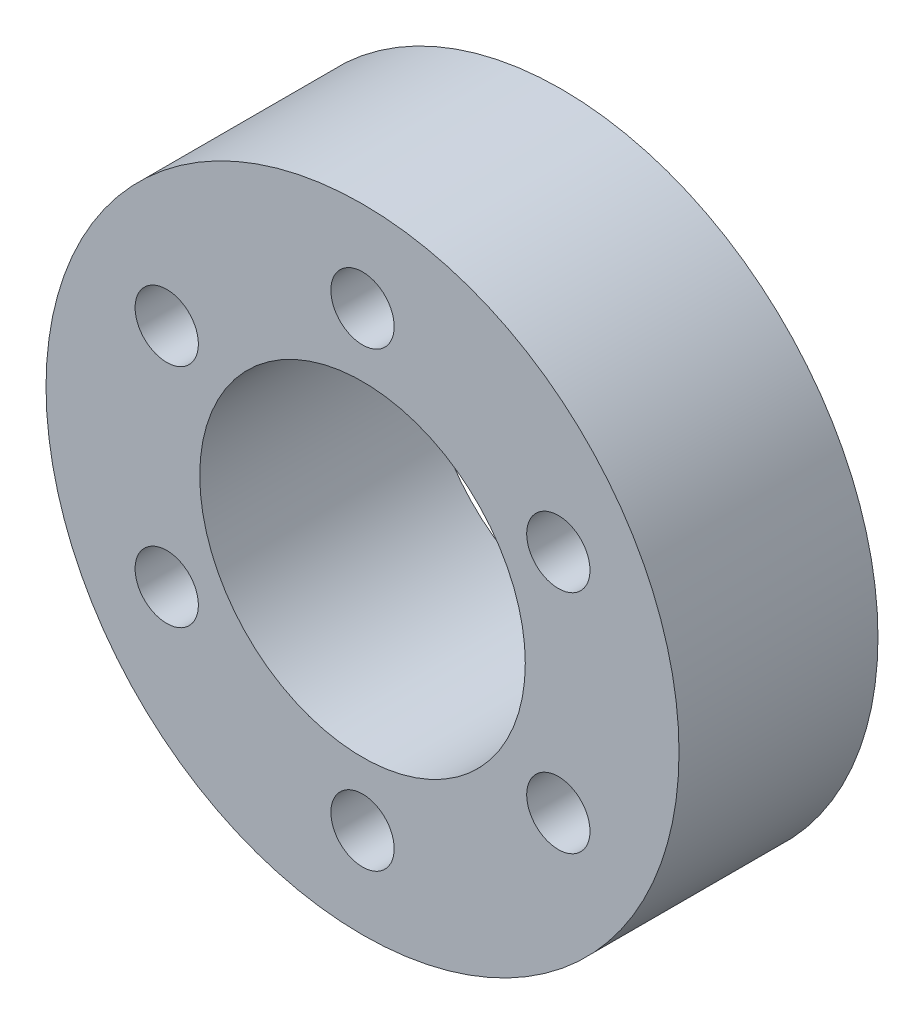
ISO-10303-21;
HEADER;
FILE_DESCRIPTION(('STEP AP214'),'2;1');
FILE_NAME('part.step','',(''),(''),'','','');
FILE_SCHEMA(('AUTOMOTIVE_DESIGN { 1 0 10303 214 1 1 1 1 }'));
ENDSEC;
DATA;
#1=APPLICATION_CONTEXT('core data for automotive mechanical design processes');
#2=APPLICATION_PROTOCOL_DEFINITION('international standard','automotive_design',2000,#1);
#3=PRODUCT_CONTEXT('',#1,'mechanical');
#4=PRODUCT('Part','Part','',(#3));
#5=PRODUCT_RELATED_PRODUCT_CATEGORY('part','',(#4));
#6=PRODUCT_DEFINITION_FORMATION('','',#4);
#7=PRODUCT_DEFINITION_CONTEXT('part definition',#1,'design');
#8=PRODUCT_DEFINITION('design','',#6,#7);
#9=PRODUCT_DEFINITION_SHAPE('','',#8);
#10=(LENGTH_UNIT() NAMED_UNIT(*) SI_UNIT(.MILLI.,.METRE.));
#11=(NAMED_UNIT(*) PLANE_ANGLE_UNIT() SI_UNIT($,.RADIAN.));
#12=(NAMED_UNIT(*) SI_UNIT($,.STERADIAN.) SOLID_ANGLE_UNIT());
#13=UNCERTAINTY_MEASURE_WITH_UNIT(LENGTH_MEASURE(1.E-05),#10,'distance_accuracy_value','');
#14=(GEOMETRIC_REPRESENTATION_CONTEXT(3) GLOBAL_UNCERTAINTY_ASSIGNED_CONTEXT((#13)) GLOBAL_UNIT_ASSIGNED_CONTEXT((#10,
#11,#12)) REPRESENTATION_CONTEXT('',''));
#15=CARTESIAN_POINT('',(0.,0.,0.));
#16=DIRECTION('',(0.,0.,1.));
#17=DIRECTION('',(1.,0.,0.));
#18=AXIS2_PLACEMENT_3D('',#15,#16,#17);
#19=CARTESIAN_POINT('',(0.,0.,1.5));
#20=DIRECTION('',(0.,0.,-1.));
#21=DIRECTION('',(-1.,0.,0.));
#22=AXIS2_PLACEMENT_3D('',#19,#20,#21);
#23=CYLINDRICAL_SURFACE('',#22,14.5);
#24=CARTESIAN_POINT('',(0.,0.,1.5));
#25=DIRECTION('',(0.,0.,1.));
#26=DIRECTION('',(1.,0.,0.));
#27=AXIS2_PLACEMENT_3D('',#24,#25,#26);
#28=CIRCLE('',#27,14.5);
#29=CARTESIAN_POINT('',(14.5,0.,1.5));
#30=VERTEX_POINT('',#29);
#31=EDGE_CURVE('E10',#30,#30,#28,.T.);
#32=ORIENTED_EDGE('',*,*,#31,.F.);
#33=EDGE_LOOP('',(#32));
#34=FACE_BOUND('',#33,.T.);
#35=CARTESIAN_POINT('',(0.,0.,0.));
#36=DIRECTION('',(0.,0.,1.));
#37=DIRECTION('',(1.,0.,0.));
#38=AXIS2_PLACEMENT_3D('',#35,#36,#37);
#39=CIRCLE('',#38,14.5);
#40=CARTESIAN_POINT('',(14.5,0.,0.));
#41=VERTEX_POINT('',#40);
#42=EDGE_CURVE('E51',#41,#41,#39,.T.);
#43=ORIENTED_EDGE('',*,*,#42,.T.);
#44=EDGE_LOOP('',(#43));
#45=FACE_BOUND('',#44,.T.);
#46=ADVANCED_FACE('F43',(#34,#45),#23,.T.);
#47=CARTESIAN_POINT('',(0.,0.,0.));
#48=DIRECTION('',(0.,0.,1.));
#49=DIRECTION('',(1.,0.,0.));
#50=AXIS2_PLACEMENT_3D('',#47,#48,#49);
#51=PLANE('',#50);
#52=CARTESIAN_POINT('',(0.,12.5,0.));
#53=DIRECTION('',(0.,0.,-1.));
#54=DIRECTION('',(-1.,0.,0.));
#55=AXIS2_PLACEMENT_3D('',#52,#53,#54);
#56=CIRCLE('',#55,1.75);
#57=CARTESIAN_POINT('',(-1.75,12.5,0.));
#58=VERTEX_POINT('',#57);
#59=EDGE_CURVE('E68',#58,#58,#56,.T.);
#60=ORIENTED_EDGE('',*,*,#59,.F.);
#61=EDGE_LOOP('',(#60));
#62=FACE_BOUND('',#61,.T.);
#63=CARTESIAN_POINT('',(0.,-12.5,0.));
#64=DIRECTION('',(0.,0.,-1.));
#65=DIRECTION('',(-1.,0.,0.));
#66=AXIS2_PLACEMENT_3D('',#63,#64,#65);
#67=CIRCLE('',#66,1.75);
#68=CARTESIAN_POINT('',(-1.74999999999991,-12.5,0.));
#69=VERTEX_POINT('',#68);
#70=EDGE_CURVE('E109',#69,#69,#67,.T.);
#71=ORIENTED_EDGE('',*,*,#70,.F.);
#72=EDGE_LOOP('',(#71));
#73=FACE_BOUND('',#72,.T.);
#74=CARTESIAN_POINT('',(-10.8253175473055,-6.25000000000005,0.));
#75=DIRECTION('',(0.,0.,-1.));
#76=DIRECTION('',(-1.,0.,0.));
#77=AXIS2_PLACEMENT_3D('',#74,#75,#76);
#78=CIRCLE('',#77,1.75);
#79=CARTESIAN_POINT('',(-12.5753175473055,-6.25000000000005,0.));
#80=VERTEX_POINT('',#79);
#81=EDGE_CURVE('E115',#80,#80,#78,.T.);
#82=ORIENTED_EDGE('',*,*,#81,.F.);
#83=EDGE_LOOP('',(#82));
#84=FACE_BOUND('',#83,.T.);
#85=CARTESIAN_POINT('',(-10.8253175473055,6.24999999999998,0.));
#86=DIRECTION('',(0.,0.,-1.));
#87=DIRECTION('',(-1.,0.,0.));
#88=AXIS2_PLACEMENT_3D('',#85,#86,#87);
#89=CIRCLE('',#88,1.75);
#90=CARTESIAN_POINT('',(-12.5753175473055,6.24999999999998,0.));
#91=VERTEX_POINT('',#90);
#92=EDGE_CURVE('E110',#91,#91,#89,.T.);
#93=ORIENTED_EDGE('',*,*,#92,.F.);
#94=EDGE_LOOP('',(#93));
#95=FACE_BOUND('',#94,.T.);
#96=CARTESIAN_POINT('',(0.,0.,0.));
#97=DIRECTION('',(0.,0.,-1.));
#98=DIRECTION('',(-1.,0.,0.));
#99=AXIS2_PLACEMENT_3D('',#96,#97,#98);
#100=CIRCLE('',#99,9.);
#101=CARTESIAN_POINT('',(-9.,0.,0.));
#102=VERTEX_POINT('',#101);
#103=EDGE_CURVE('E114',#102,#102,#100,.T.);
#104=ORIENTED_EDGE('',*,*,#103,.F.);
#105=EDGE_LOOP('',(#104));
#106=FACE_BOUND('',#105,.T.);
#107=CARTESIAN_POINT('',(10.8253175473055,-6.2499999999999,0.));
#108=DIRECTION('',(0.,0.,-1.));
#109=DIRECTION('',(-1.,0.,0.));
#110=AXIS2_PLACEMENT_3D('',#107,#108,#109);
#111=CIRCLE('',#110,1.75);
#112=CARTESIAN_POINT('',(9.07531754730555,-6.2499999999999,0.));
#113=VERTEX_POINT('',#112);
#114=EDGE_CURVE('E105',#113,#113,#111,.T.);
#115=ORIENTED_EDGE('',*,*,#114,.F.);
#116=EDGE_LOOP('',(#115));
#117=FACE_BOUND('',#116,.T.);
#118=CARTESIAN_POINT('',(10.8253175473054,6.25000000000013,0.));
#119=DIRECTION('',(0.,0.,-1.));
#120=DIRECTION('',(-1.,0.,0.));
#121=AXIS2_PLACEMENT_3D('',#118,#119,#120);
#122=CIRCLE('',#121,1.75);
#123=CARTESIAN_POINT('',(9.07531754730541,6.25000000000013,0.));
#124=VERTEX_POINT('',#123);
#125=EDGE_CURVE('E101',#124,#124,#122,.T.);
#126=ORIENTED_EDGE('',*,*,#125,.F.);
#127=EDGE_LOOP('',(#126));
#128=FACE_BOUND('',#127,.T.);
#129=ORIENTED_EDGE('',*,*,#42,.F.);
#130=EDGE_LOOP('',(#129));
#131=FACE_BOUND('',#130,.T.);
#132=ADVANCED_FACE('F131',(#62,#73,#84,#95,#106,#117,#128,#131),#51,.F.);
#133=CARTESIAN_POINT('',(0.,0.,12.5));
#134=DIRECTION('',(0.,0.,-1.));
#135=DIRECTION('',(-1.,0.,0.));
#136=AXIS2_PLACEMENT_3D('',#133,#134,#135);
#137=CYLINDRICAL_SURFACE('',#136,17.5);
#138=CARTESIAN_POINT('',(0.,0.,12.5));
#139=DIRECTION('',(0.,0.,1.));
#140=DIRECTION('',(1.,0.,0.));
#141=AXIS2_PLACEMENT_3D('',#138,#139,#140);
#142=CIRCLE('',#141,17.5);
#143=CARTESIAN_POINT('',(17.5,0.,12.5));
#144=VERTEX_POINT('',#143);
#145=EDGE_CURVE('E57',#144,#144,#142,.T.);
#146=ORIENTED_EDGE('',*,*,#145,.F.);
#147=EDGE_LOOP('',(#146));
#148=FACE_BOUND('',#147,.T.);
#149=CARTESIAN_POINT('',(0.,0.,1.5));
#150=DIRECTION('',(0.,0.,1.));
#151=DIRECTION('',(1.,0.,0.));
#152=AXIS2_PLACEMENT_3D('',#149,#150,#151);
#153=CIRCLE('',#152,17.5);
#154=CARTESIAN_POINT('',(17.5,0.,1.5));
#155=VERTEX_POINT('',#154);
#156=EDGE_CURVE('E60',#155,#155,#153,.T.);
#157=ORIENTED_EDGE('',*,*,#156,.T.);
#158=EDGE_LOOP('',(#157));
#159=FACE_BOUND('',#158,.T.);
#160=ADVANCED_FACE('F134',(#148,#159),#137,.T.);
#161=CARTESIAN_POINT('',(0.,0.,12.5));
#162=DIRECTION('',(0.,0.,1.));
#163=DIRECTION('',(1.,0.,0.));
#164=AXIS2_PLACEMENT_3D('',#161,#162,#163);
#165=PLANE('',#164);
#166=CARTESIAN_POINT('',(0.,12.5,12.5));
#167=DIRECTION('',(0.,0.,1.));
#168=DIRECTION('',(1.,0.,0.));
#169=AXIS2_PLACEMENT_3D('',#166,#167,#168);
#170=CIRCLE('',#169,1.75);
#171=CARTESIAN_POINT('',(1.75,12.5,12.5));
#172=VERTEX_POINT('',#171);
#173=EDGE_CURVE('E46',#172,#172,#170,.T.);
#174=ORIENTED_EDGE('',*,*,#173,.F.);
#175=EDGE_LOOP('',(#174));
#176=FACE_BOUND('',#175,.T.);
#177=CARTESIAN_POINT('',(0.,-12.5,12.5));
#178=DIRECTION('',(0.,0.,1.));
#179=DIRECTION('',(1.,0.,0.));
#180=AXIS2_PLACEMENT_3D('',#177,#178,#179);
#181=CIRCLE('',#180,1.75);
#182=CARTESIAN_POINT('',(1.75000000000009,-12.5,12.5));
#183=VERTEX_POINT('',#182);
#184=EDGE_CURVE('E83',#183,#183,#181,.T.);
#185=ORIENTED_EDGE('',*,*,#184,.F.);
#186=EDGE_LOOP('',(#185));
#187=FACE_BOUND('',#186,.T.);
#188=CARTESIAN_POINT('',(-10.8253175473055,-6.25000000000005,12.5));
#189=DIRECTION('',(0.,0.,1.));
#190=DIRECTION('',(1.,0.,0.));
#191=AXIS2_PLACEMENT_3D('',#188,#189,#190);
#192=CIRCLE('',#191,1.75);
#193=CARTESIAN_POINT('',(-9.07531754730546,-6.25000000000005,12.5));
#194=VERTEX_POINT('',#193);
#195=EDGE_CURVE('E80',#194,#194,#192,.T.);
#196=ORIENTED_EDGE('',*,*,#195,.F.);
#197=EDGE_LOOP('',(#196));
#198=FACE_BOUND('',#197,.T.);
#199=CARTESIAN_POINT('',(-10.8253175473055,6.24999999999998,12.5));
#200=DIRECTION('',(0.,0.,1.));
#201=DIRECTION('',(1.,0.,0.));
#202=AXIS2_PLACEMENT_3D('',#199,#200,#201);
#203=CIRCLE('',#202,1.75);
#204=CARTESIAN_POINT('',(-9.0753175473055,6.24999999999998,12.5));
#205=VERTEX_POINT('',#204);
#206=EDGE_CURVE('E76',#205,#205,#203,.T.);
#207=ORIENTED_EDGE('',*,*,#206,.F.);
#208=EDGE_LOOP('',(#207));
#209=FACE_BOUND('',#208,.T.);
#210=CARTESIAN_POINT('',(0.,0.,12.5));
#211=DIRECTION('',(0.,0.,1.));
#212=DIRECTION('',(1.,0.,0.));
#213=AXIS2_PLACEMENT_3D('',#210,#211,#212);
#214=CIRCLE('',#213,9.);
#215=CARTESIAN_POINT('',(9.,0.,12.5));
#216=VERTEX_POINT('',#215);
#217=EDGE_CURVE('E72',#216,#216,#214,.T.);
#218=ORIENTED_EDGE('',*,*,#217,.F.);
#219=EDGE_LOOP('',(#218));
#220=FACE_BOUND('',#219,.T.);
#221=CARTESIAN_POINT('',(10.8253175473055,-6.2499999999999,12.5));
#222=DIRECTION('',(0.,0.,1.));
#223=DIRECTION('',(1.,0.,0.));
#224=AXIS2_PLACEMENT_3D('',#221,#222,#223);
#225=CIRCLE('',#224,1.75);
#226=CARTESIAN_POINT('',(12.5753175473055,-6.2499999999999,12.5));
#227=VERTEX_POINT('',#226);
#228=EDGE_CURVE('E67',#227,#227,#225,.T.);
#229=ORIENTED_EDGE('',*,*,#228,.F.);
#230=EDGE_LOOP('',(#229));
#231=FACE_BOUND('',#230,.T.);
#232=CARTESIAN_POINT('',(10.8253175473054,6.25000000000013,12.5));
#233=DIRECTION('',(0.,0.,1.));
#234=DIRECTION('',(1.,0.,0.));
#235=AXIS2_PLACEMENT_3D('',#232,#233,#234);
#236=CIRCLE('',#235,1.75);
#237=CARTESIAN_POINT('',(12.5753175473054,6.25000000000013,12.5));
#238=VERTEX_POINT('',#237);
#239=EDGE_CURVE('E63',#238,#238,#236,.T.);
#240=ORIENTED_EDGE('',*,*,#239,.F.);
#241=EDGE_LOOP('',(#240));
#242=FACE_BOUND('',#241,.T.);
#243=ORIENTED_EDGE('',*,*,#145,.T.);
#244=EDGE_LOOP('',(#243));
#245=FACE_BOUND('',#244,.T.);
#246=ADVANCED_FACE('F161',(#176,#187,#198,#209,#220,#231,#242,#245),#165,.T.);
#247=CARTESIAN_POINT('',(0.,0.,1.5));
#248=DIRECTION('',(0.,0.,1.));
#249=DIRECTION('',(1.,0.,0.));
#250=AXIS2_PLACEMENT_3D('',#247,#248,#249);
#251=PLANE('',#250);
#252=ORIENTED_EDGE('',*,*,#31,.T.);
#253=EDGE_LOOP('',(#252));
#254=FACE_BOUND('',#253,.T.);
#255=ORIENTED_EDGE('',*,*,#156,.F.);
#256=EDGE_LOOP('',(#255));
#257=FACE_BOUND('',#256,.T.);
#258=ADVANCED_FACE('F168',(#254,#257),#251,.F.);
#259=CARTESIAN_POINT('',(10.8253175473054,6.25000000000013,26.5));
#260=DIRECTION('',(0.,0.,-1.));
#261=DIRECTION('',(-1.,0.,0.));
#262=AXIS2_PLACEMENT_3D('',#259,#260,#261);
#263=CYLINDRICAL_SURFACE('',#262,1.75);
#264=ORIENTED_EDGE('',*,*,#239,.T.);
#265=EDGE_LOOP('',(#264));
#266=FACE_BOUND('',#265,.T.);
#267=ORIENTED_EDGE('',*,*,#125,.T.);
#268=EDGE_LOOP('',(#267));
#269=FACE_BOUND('',#268,.T.);
#270=ADVANCED_FACE('F171',(#266,#269),#263,.F.);
#271=CARTESIAN_POINT('',(10.8253175473055,-6.2499999999999,26.5));
#272=DIRECTION('',(0.,0.,-1.));
#273=DIRECTION('',(-1.,0.,0.));
#274=AXIS2_PLACEMENT_3D('',#271,#272,#273);
#275=CYLINDRICAL_SURFACE('',#274,1.75);
#276=ORIENTED_EDGE('',*,*,#228,.T.);
#277=EDGE_LOOP('',(#276));
#278=FACE_BOUND('',#277,.T.);
#279=ORIENTED_EDGE('',*,*,#114,.T.);
#280=EDGE_LOOP('',(#279));
#281=FACE_BOUND('',#280,.T.);
#282=ADVANCED_FACE('F191',(#278,#281),#275,.F.);
#283=CARTESIAN_POINT('',(0.,0.,26.5));
#284=DIRECTION('',(0.,0.,-1.));
#285=DIRECTION('',(-1.,0.,0.));
#286=AXIS2_PLACEMENT_3D('',#283,#284,#285);
#287=CYLINDRICAL_SURFACE('',#286,9.);
#288=ORIENTED_EDGE('',*,*,#217,.T.);
#289=EDGE_LOOP('',(#288));
#290=FACE_BOUND('',#289,.T.);
#291=ORIENTED_EDGE('',*,*,#103,.T.);
#292=EDGE_LOOP('',(#291));
#293=FACE_BOUND('',#292,.T.);
#294=ADVANCED_FACE('F200',(#290,#293),#287,.F.);
#295=CARTESIAN_POINT('',(-10.8253175473055,6.24999999999998,26.5));
#296=DIRECTION('',(0.,0.,-1.));
#297=DIRECTION('',(-1.,0.,0.));
#298=AXIS2_PLACEMENT_3D('',#295,#296,#297);
#299=CYLINDRICAL_SURFACE('',#298,1.75);
#300=ORIENTED_EDGE('',*,*,#206,.T.);
#301=EDGE_LOOP('',(#300));
#302=FACE_BOUND('',#301,.T.);
#303=ORIENTED_EDGE('',*,*,#92,.T.);
#304=EDGE_LOOP('',(#303));
#305=FACE_BOUND('',#304,.T.);
#306=ADVANCED_FACE('F209',(#302,#305),#299,.F.);
#307=CARTESIAN_POINT('',(-10.8253175473055,-6.25000000000005,26.5));
#308=DIRECTION('',(0.,0.,-1.));
#309=DIRECTION('',(-1.,0.,0.));
#310=AXIS2_PLACEMENT_3D('',#307,#308,#309);
#311=CYLINDRICAL_SURFACE('',#310,1.75);
#312=ORIENTED_EDGE('',*,*,#195,.T.);
#313=EDGE_LOOP('',(#312));
#314=FACE_BOUND('',#313,.T.);
#315=ORIENTED_EDGE('',*,*,#81,.T.);
#316=EDGE_LOOP('',(#315));
#317=FACE_BOUND('',#316,.T.);
#318=ADVANCED_FACE('F218',(#314,#317),#311,.F.);
#319=CARTESIAN_POINT('',(0.,-12.5,26.5));
#320=DIRECTION('',(0.,0.,-1.));
#321=DIRECTION('',(-1.,0.,0.));
#322=AXIS2_PLACEMENT_3D('',#319,#320,#321);
#323=CYLINDRICAL_SURFACE('',#322,1.75);
#324=ORIENTED_EDGE('',*,*,#184,.T.);
#325=EDGE_LOOP('',(#324));
#326=FACE_BOUND('',#325,.T.);
#327=ORIENTED_EDGE('',*,*,#70,.T.);
#328=EDGE_LOOP('',(#327));
#329=FACE_BOUND('',#328,.T.);
#330=ADVANCED_FACE('F227',(#326,#329),#323,.F.);
#331=CARTESIAN_POINT('',(0.,12.5,26.5));
#332=DIRECTION('',(0.,0.,-1.));
#333=DIRECTION('',(-1.,0.,0.));
#334=AXIS2_PLACEMENT_3D('',#331,#332,#333);
#335=CYLINDRICAL_SURFACE('',#334,1.75);
#336=ORIENTED_EDGE('',*,*,#173,.T.);
#337=EDGE_LOOP('',(#336));
#338=FACE_BOUND('',#337,.T.);
#339=ORIENTED_EDGE('',*,*,#59,.T.);
#340=EDGE_LOOP('',(#339));
#341=FACE_BOUND('',#340,.T.);
#342=ADVANCED_FACE('F129',(#338,#341),#335,.F.);
#343=CLOSED_SHELL('',(#46,#132,#160,#246,#258,#270,#282,#294,#306,#318,#330,#342));
#344=MANIFOLD_SOLID_BREP('B2',#343);
#345=ADVANCED_BREP_SHAPE_REPRESENTATION('',(#18,#344),#14);
#346=SHAPE_DEFINITION_REPRESENTATION(#9,#345);
ENDSEC;
END-ISO-10303-21;
